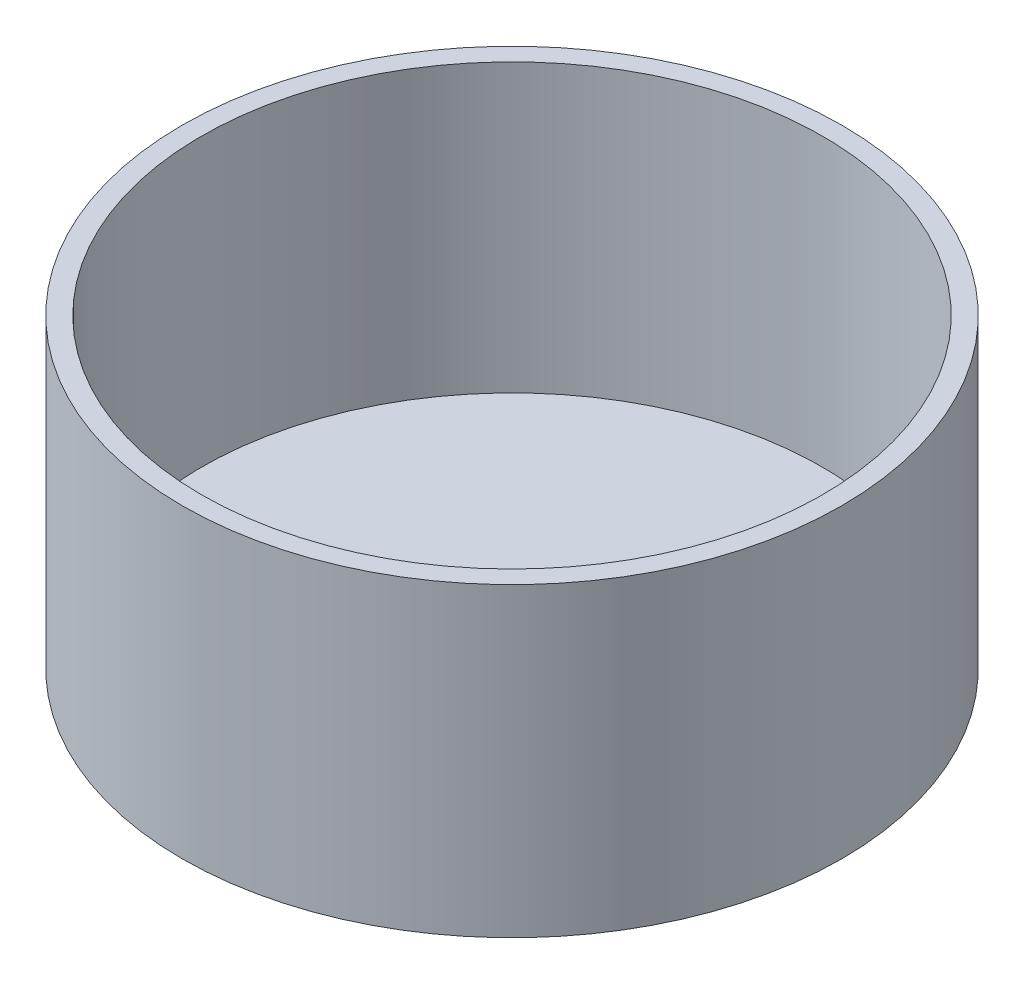
ISO-10303-21;
HEADER;
FILE_DESCRIPTION(('STEP AP214'),'2;1');
FILE_NAME('part.step','',(''),(''),'','','');
FILE_SCHEMA(('AUTOMOTIVE_DESIGN { 1 0 10303 214 1 1 1 1 }'));
ENDSEC;
DATA;
#1=APPLICATION_CONTEXT('core data for automotive mechanical design processes');
#2=APPLICATION_PROTOCOL_DEFINITION('international standard','automotive_design',2000,#1);
#3=PRODUCT_CONTEXT('',#1,'mechanical');
#4=PRODUCT('Part','Part','',(#3));
#5=PRODUCT_RELATED_PRODUCT_CATEGORY('part','',(#4));
#6=PRODUCT_DEFINITION_FORMATION('','',#4);
#7=PRODUCT_DEFINITION_CONTEXT('part definition',#1,'design');
#8=PRODUCT_DEFINITION('design','',#6,#7);
#9=PRODUCT_DEFINITION_SHAPE('','',#8);
#10=(LENGTH_UNIT() NAMED_UNIT(*) SI_UNIT(.MILLI.,.METRE.));
#11=(NAMED_UNIT(*) PLANE_ANGLE_UNIT() SI_UNIT($,.RADIAN.));
#12=(NAMED_UNIT(*) SI_UNIT($,.STERADIAN.) SOLID_ANGLE_UNIT());
#13=UNCERTAINTY_MEASURE_WITH_UNIT(LENGTH_MEASURE(1.E-05),#10,'distance_accuracy_value','');
#14=(GEOMETRIC_REPRESENTATION_CONTEXT(3) GLOBAL_UNCERTAINTY_ASSIGNED_CONTEXT((#13)) GLOBAL_UNIT_ASSIGNED_CONTEXT((#10,
#11,#12)) REPRESENTATION_CONTEXT('',''));
#15=CARTESIAN_POINT('',(0.,0.,0.));
#16=DIRECTION('',(0.,0.,1.));
#17=DIRECTION('',(1.,0.,0.));
#18=AXIS2_PLACEMENT_3D('',#15,#16,#17);
#19=CARTESIAN_POINT('',(0.,30.,0.));
#20=DIRECTION('',(0.,-1.,0.));
#21=DIRECTION('',(0.,0.,-1.));
#22=AXIS2_PLACEMENT_3D('',#19,#20,#21);
#23=CYLINDRICAL_SURFACE('',#22,34.5);
#24=CARTESIAN_POINT('',(0.,30.,0.));
#25=DIRECTION('',(0.,1.,0.));
#26=DIRECTION('',(0.,0.,1.));
#27=AXIS2_PLACEMENT_3D('',#24,#25,#26);
#28=CIRCLE('',#27,34.5);
#29=CARTESIAN_POINT('',(0.,30.,34.5));
#30=VERTEX_POINT('',#29);
#31=EDGE_CURVE('E10',#30,#30,#28,.T.);
#32=ORIENTED_EDGE('',*,*,#31,.F.);
#33=EDGE_LOOP('',(#32));
#34=FACE_BOUND('',#33,.T.);
#35=CARTESIAN_POINT('',(0.,-2.,0.));
#36=DIRECTION('',(0.,1.,0.));
#37=DIRECTION('',(0.,0.,1.));
#38=AXIS2_PLACEMENT_3D('',#35,#36,#37);
#39=CIRCLE('',#38,34.5);
#40=CARTESIAN_POINT('',(0.,-2.,34.5));
#41=VERTEX_POINT('',#40);
#42=EDGE_CURVE('E45',#41,#41,#39,.T.);
#43=ORIENTED_EDGE('',*,*,#42,.T.);
#44=EDGE_LOOP('',(#43));
#45=FACE_BOUND('',#44,.T.);
#46=ADVANCED_FACE('F37',(#34,#45),#23,.T.);
#47=CARTESIAN_POINT('',(0.,30.,0.));
#48=DIRECTION('',(0.,1.,0.));
#49=DIRECTION('',(0.,0.,1.));
#50=AXIS2_PLACEMENT_3D('',#47,#48,#49);
#51=PLANE('',#50);
#52=CARTESIAN_POINT('',(0.,30.,0.));
#53=DIRECTION('',(0.,1.,0.));
#54=DIRECTION('',(0.,0.,1.));
#55=AXIS2_PLACEMENT_3D('',#52,#53,#54);
#56=CIRCLE('',#55,32.5);
#57=CARTESIAN_POINT('',(0.,30.,32.5));
#58=VERTEX_POINT('',#57);
#59=EDGE_CURVE('E50',#58,#58,#56,.T.);
#60=ORIENTED_EDGE('',*,*,#59,.F.);
#61=EDGE_LOOP('',(#60));
#62=FACE_BOUND('',#61,.T.);
#63=ORIENTED_EDGE('',*,*,#31,.T.);
#64=EDGE_LOOP('',(#63));
#65=FACE_BOUND('',#64,.T.);
#66=ADVANCED_FACE('F73',(#62,#65),#51,.T.);
#67=CARTESIAN_POINT('',(0.,-2.,0.));
#68=DIRECTION('',(0.,1.,0.));
#69=DIRECTION('',(0.,0.,1.));
#70=AXIS2_PLACEMENT_3D('',#67,#68,#69);
#71=PLANE('',#70);
#72=ORIENTED_EDGE('',*,*,#42,.F.);
#73=EDGE_LOOP('',(#72));
#74=FACE_BOUND('',#73,.T.);
#75=ADVANCED_FACE('F39',(#74),#71,.F.);
#76=CARTESIAN_POINT('',(0.,30.,0.));
#77=DIRECTION('',(0.,-1.,0.));
#78=DIRECTION('',(0.,0.,-1.));
#79=AXIS2_PLACEMENT_3D('',#76,#77,#78);
#80=CYLINDRICAL_SURFACE('',#79,32.5);
#81=ORIENTED_EDGE('',*,*,#59,.T.);
#82=EDGE_LOOP('',(#81));
#83=FACE_BOUND('',#82,.T.);
#84=CARTESIAN_POINT('',(0.,0.,0.));
#85=DIRECTION('',(0.,1.,0.));
#86=DIRECTION('',(0.,0.,1.));
#87=AXIS2_PLACEMENT_3D('',#84,#85,#86);
#88=CIRCLE('',#87,32.5);
#89=CARTESIAN_POINT('',(0.,0.,32.5));
#90=VERTEX_POINT('',#89);
#91=EDGE_CURVE('E55',#90,#90,#88,.T.);
#92=ORIENTED_EDGE('',*,*,#91,.F.);
#93=EDGE_LOOP('',(#92));
#94=FACE_BOUND('',#93,.T.);
#95=ADVANCED_FACE('F64',(#83,#94),#80,.F.);
#96=CARTESIAN_POINT('',(0.,0.,0.));
#97=DIRECTION('',(0.,1.,0.));
#98=DIRECTION('',(0.,0.,1.));
#99=AXIS2_PLACEMENT_3D('',#96,#97,#98);
#100=PLANE('',#99);
#101=ORIENTED_EDGE('',*,*,#91,.T.);
#102=EDGE_LOOP('',(#101));
#103=FACE_BOUND('',#102,.T.);
#104=ADVANCED_FACE('F62',(#103),#100,.T.);
#105=CLOSED_SHELL('',(#46,#66,#75,#95,#104));
#106=MANIFOLD_SOLID_BREP('B2',#105);
#107=ADVANCED_BREP_SHAPE_REPRESENTATION('',(#18,#106),#14);
#108=SHAPE_DEFINITION_REPRESENTATION(#9,#107);
ENDSEC;
END-ISO-10303-21;
